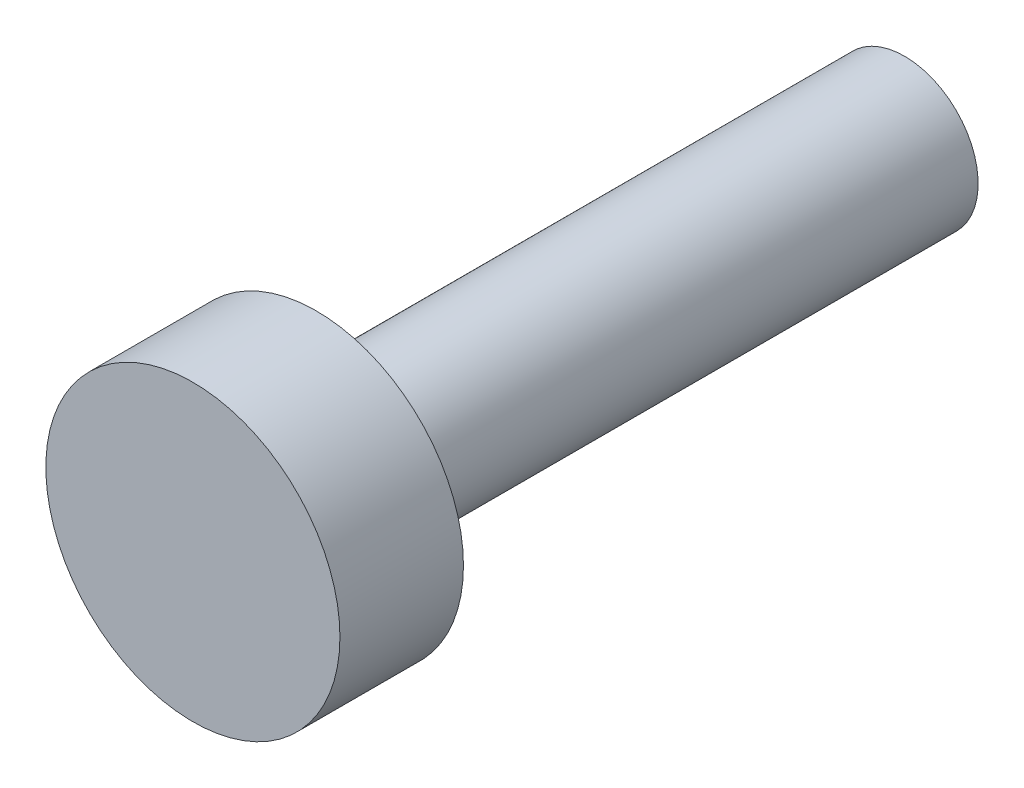
ISO-10303-21;
HEADER;
FILE_DESCRIPTION(('STEP AP214'),'2;1');
FILE_NAME('part.step','',(''),(''),'','','');
FILE_SCHEMA(('AUTOMOTIVE_DESIGN { 1 0 10303 214 1 1 1 1 }'));
ENDSEC;
DATA;
#1=APPLICATION_CONTEXT('core data for automotive mechanical design processes');
#2=APPLICATION_PROTOCOL_DEFINITION('international standard','automotive_design',2000,#1);
#3=PRODUCT_CONTEXT('',#1,'mechanical');
#4=PRODUCT('Part','Part','',(#3));
#5=PRODUCT_RELATED_PRODUCT_CATEGORY('part','',(#4));
#6=PRODUCT_DEFINITION_FORMATION('','',#4);
#7=PRODUCT_DEFINITION_CONTEXT('part definition',#1,'design');
#8=PRODUCT_DEFINITION('design','',#6,#7);
#9=PRODUCT_DEFINITION_SHAPE('','',#8);
#10=(LENGTH_UNIT() NAMED_UNIT(*) SI_UNIT(.MILLI.,.METRE.));
#11=(NAMED_UNIT(*) PLANE_ANGLE_UNIT() SI_UNIT($,.RADIAN.));
#12=(NAMED_UNIT(*) SI_UNIT($,.STERADIAN.) SOLID_ANGLE_UNIT());
#13=UNCERTAINTY_MEASURE_WITH_UNIT(LENGTH_MEASURE(1.E-05),#10,'distance_accuracy_value','');
#14=(GEOMETRIC_REPRESENTATION_CONTEXT(3) GLOBAL_UNCERTAINTY_ASSIGNED_CONTEXT((#13)) GLOBAL_UNIT_ASSIGNED_CONTEXT((#10,
#11,#12)) REPRESENTATION_CONTEXT('',''));
#15=CARTESIAN_POINT('',(0.,0.,0.));
#16=DIRECTION('',(0.,0.,1.));
#17=DIRECTION('',(1.,0.,0.));
#18=AXIS2_PLACEMENT_3D('',#15,#16,#17);
#19=CARTESIAN_POINT('',(0.,0.,2.1));
#20=DIRECTION('',(0.,0.,-1.));
#21=DIRECTION('',(-1.,0.,0.));
#22=AXIS2_PLACEMENT_3D('',#19,#20,#21);
#23=CYLINDRICAL_SURFACE('',#22,2.5);
#24=CARTESIAN_POINT('',(0.,0.,2.1));
#25=DIRECTION('',(0.,0.,1.));
#26=DIRECTION('',(1.,0.,0.));
#27=AXIS2_PLACEMENT_3D('',#24,#25,#26);
#28=CIRCLE('',#27,2.5);
#29=CARTESIAN_POINT('',(2.5,0.,2.1));
#30=VERTEX_POINT('',#29);
#31=EDGE_CURVE('E38',#30,#30,#28,.T.);
#32=ORIENTED_EDGE('',*,*,#31,.F.);
#33=EDGE_LOOP('',(#32));
#34=FACE_BOUND('',#33,.T.);
#35=CARTESIAN_POINT('',(0.,0.,0.));
#36=DIRECTION('',(0.,0.,1.));
#37=DIRECTION('',(1.,0.,0.));
#38=AXIS2_PLACEMENT_3D('',#35,#36,#37);
#39=CIRCLE('',#38,2.5);
#40=CARTESIAN_POINT('',(2.5,0.,0.));
#41=VERTEX_POINT('',#40);
#42=EDGE_CURVE('E34',#41,#41,#39,.T.);
#43=ORIENTED_EDGE('',*,*,#42,.T.);
#44=EDGE_LOOP('',(#43));
#45=FACE_BOUND('',#44,.T.);
#46=ADVANCED_FACE('F31',(#34,#45),#23,.T.);
#47=CARTESIAN_POINT('',(0.,0.,2.1));
#48=DIRECTION('',(0.,0.,1.));
#49=DIRECTION('',(1.,0.,0.));
#50=AXIS2_PLACEMENT_3D('',#47,#48,#49);
#51=PLANE('',#50);
#52=ORIENTED_EDGE('',*,*,#31,.T.);
#53=EDGE_LOOP('',(#52));
#54=FACE_BOUND('',#53,.T.);
#55=ADVANCED_FACE('F55',(#54),#51,.T.);
#56=CARTESIAN_POINT('',(0.,0.,0.));
#57=DIRECTION('',(0.,0.,1.));
#58=DIRECTION('',(1.,0.,0.));
#59=AXIS2_PLACEMENT_3D('',#56,#57,#58);
#60=PLANE('',#59);
#61=CARTESIAN_POINT('',(0.,0.,0.));
#62=DIRECTION('',(0.,0.,-1.));
#63=DIRECTION('',(-1.,0.,0.));
#64=AXIS2_PLACEMENT_3D('',#61,#62,#63);
#65=CIRCLE('',#64,1.25);
#66=CARTESIAN_POINT('',(-1.25,0.,0.));
#67=VERTEX_POINT('',#66);
#68=EDGE_CURVE('E10',#67,#67,#65,.T.);
#69=ORIENTED_EDGE('',*,*,#68,.F.);
#70=EDGE_LOOP('',(#69));
#71=FACE_BOUND('',#70,.T.);
#72=ORIENTED_EDGE('',*,*,#42,.F.);
#73=EDGE_LOOP('',(#72));
#74=FACE_BOUND('',#73,.T.);
#75=ADVANCED_FACE('F52',(#71,#74),#60,.F.);
#76=CARTESIAN_POINT('',(0.,0.,-10.));
#77=DIRECTION('',(0.,0.,1.));
#78=DIRECTION('',(1.,0.,0.));
#79=AXIS2_PLACEMENT_3D('',#76,#77,#78);
#80=CYLINDRICAL_SURFACE('',#79,1.25);
#81=CARTESIAN_POINT('',(0.,0.,-10.));
#82=DIRECTION('',(0.,0.,-1.));
#83=DIRECTION('',(-1.,0.,0.));
#84=AXIS2_PLACEMENT_3D('',#81,#82,#83);
#85=CIRCLE('',#84,1.25);
#86=CARTESIAN_POINT('',(-1.25,0.,-10.));
#87=VERTEX_POINT('',#86);
#88=EDGE_CURVE('E44',#87,#87,#85,.T.);
#89=ORIENTED_EDGE('',*,*,#88,.F.);
#90=EDGE_LOOP('',(#89));
#91=FACE_BOUND('',#90,.T.);
#92=ORIENTED_EDGE('',*,*,#68,.T.);
#93=EDGE_LOOP('',(#92));
#94=FACE_BOUND('',#93,.T.);
#95=ADVANCED_FACE('F54',(#91,#94),#80,.T.);
#96=CARTESIAN_POINT('',(0.,0.,-10.));
#97=DIRECTION('',(0.,0.,-1.));
#98=DIRECTION('',(-1.,0.,0.));
#99=AXIS2_PLACEMENT_3D('',#96,#97,#98);
#100=PLANE('',#99);
#101=ORIENTED_EDGE('',*,*,#88,.T.);
#102=EDGE_LOOP('',(#101));
#103=FACE_BOUND('',#102,.T.);
#104=ADVANCED_FACE('F61',(#103),#100,.T.);
#105=CLOSED_SHELL('',(#46,#55,#75,#95,#104));
#106=MANIFOLD_SOLID_BREP('B2',#105);
#107=ADVANCED_BREP_SHAPE_REPRESENTATION('',(#18,#106),#14);
#108=SHAPE_DEFINITION_REPRESENTATION(#9,#107);
ENDSEC;
END-ISO-10303-21;
